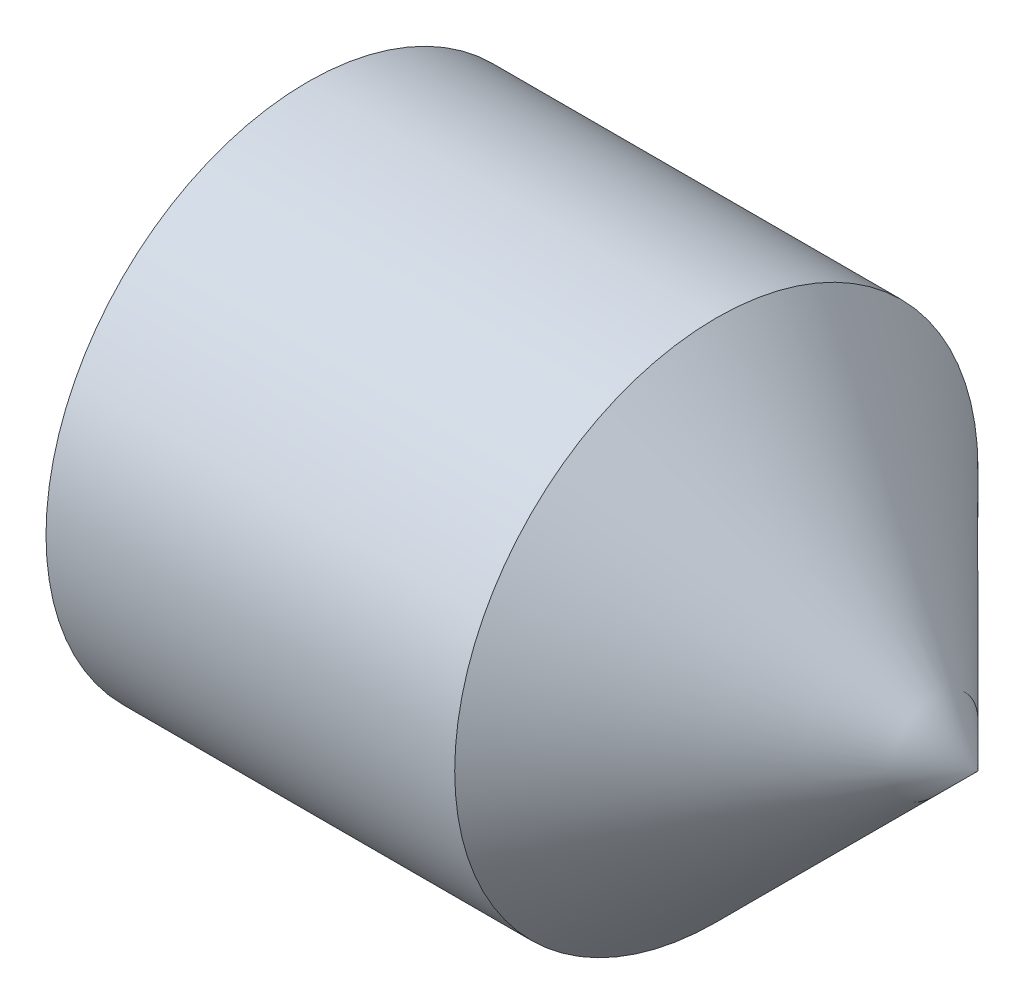
ISO-10303-21;
HEADER;
FILE_DESCRIPTION(('STEP AP214'),'2;1');
FILE_NAME('part.step','',(''),(''),'','','');
FILE_SCHEMA(('AUTOMOTIVE_DESIGN { 1 0 10303 214 1 1 1 1 }'));
ENDSEC;
DATA;
#1=APPLICATION_CONTEXT('core data for automotive mechanical design processes');
#2=APPLICATION_PROTOCOL_DEFINITION('international standard','automotive_design',2000,#1);
#3=PRODUCT_CONTEXT('',#1,'mechanical');
#4=PRODUCT('Part','Part','',(#3));
#5=PRODUCT_RELATED_PRODUCT_CATEGORY('part','',(#4));
#6=PRODUCT_DEFINITION_FORMATION('','',#4);
#7=PRODUCT_DEFINITION_CONTEXT('part definition',#1,'design');
#8=PRODUCT_DEFINITION('design','',#6,#7);
#9=PRODUCT_DEFINITION_SHAPE('','',#8);
#10=(LENGTH_UNIT() NAMED_UNIT(*) SI_UNIT(.MILLI.,.METRE.));
#11=(NAMED_UNIT(*) PLANE_ANGLE_UNIT() SI_UNIT($,.RADIAN.));
#12=(NAMED_UNIT(*) SI_UNIT($,.STERADIAN.) SOLID_ANGLE_UNIT());
#13=UNCERTAINTY_MEASURE_WITH_UNIT(LENGTH_MEASURE(1.E-05),#10,'distance_accuracy_value','');
#14=(GEOMETRIC_REPRESENTATION_CONTEXT(3) GLOBAL_UNCERTAINTY_ASSIGNED_CONTEXT((#13)) GLOBAL_UNIT_ASSIGNED_CONTEXT((#10,
#11,#12)) REPRESENTATION_CONTEXT('',''));
#15=CARTESIAN_POINT('',(0.,0.,0.));
#16=DIRECTION('',(0.,0.,1.));
#17=DIRECTION('',(1.,0.,0.));
#18=AXIS2_PLACEMENT_3D('',#15,#16,#17);
#19=CARTESIAN_POINT('',(2.,-0.749999999999996,0.433012701892218));
#20=DIRECTION('',(0.,-0.5,0.866025403784439));
#21=DIRECTION('',(0.,-0.866025403784439,-0.5));
#22=AXIS2_PLACEMENT_3D('',#19,#20,#21);
#23=PLANE('',#22);
#24=DIRECTION('',(1.,0.,0.));
#25=VECTOR('',#24,1.);
#26=CARTESIAN_POINT('',(2.,0.,0.866025403784437));
#27=LINE('',#26,#25);
#28=CARTESIAN_POINT('',(2.,0.,0.866025403784437));
#29=VERTEX_POINT('',#28);
#30=CARTESIAN_POINT('',(0.,0.,0.866025403784437));
#31=VERTEX_POINT('',#30);
#32=EDGE_CURVE('E85',#29,#31,#27,.F.);
#33=ORIENTED_EDGE('',*,*,#32,.F.);
#34=DIRECTION('',(0.,-0.866025403784439,-0.5));
#35=VECTOR('',#34,1.);
#36=CARTESIAN_POINT('',(2.,-0.749999999999996,0.433012701892218));
#37=LINE('',#36,#35);
#38=CARTESIAN_POINT('',(2.,-0.749999999999996,0.433012701892218));
#39=VERTEX_POINT('',#38);
#40=EDGE_CURVE('E64',#39,#29,#37,.F.);
#41=ORIENTED_EDGE('',*,*,#40,.F.);
#42=DIRECTION('',(1.,0.,0.));
#43=VECTOR('',#42,1.);
#44=CARTESIAN_POINT('',(2.,-0.749999999999996,0.433012701892218));
#45=LINE('',#44,#43);
#46=CARTESIAN_POINT('',(0.,-0.749999999999996,0.433012701892218));
#47=VERTEX_POINT('',#46);
#48=EDGE_CURVE('E88',#47,#39,#45,.T.);
#49=ORIENTED_EDGE('',*,*,#48,.F.);
#50=DIRECTION('',(0.,-0.866025403784439,-0.5));
#51=VECTOR('',#50,1.);
#52=CARTESIAN_POINT('',(0.,-0.749999999999996,0.433012701892218));
#53=LINE('',#52,#51);
#54=EDGE_CURVE('E73',#31,#47,#53,.T.);
#55=ORIENTED_EDGE('',*,*,#54,.F.);
#56=EDGE_LOOP('',(#33,#41,#49,#55));
#57=FACE_BOUND('',#56,.T.);
#58=ADVANCED_FACE('F17',(#57),#23,.F.);
#59=CARTESIAN_POINT('',(2.,0.750000000000003,0.433012701892217));
#60=DIRECTION('',(0.,-0.5,-0.866025403784438));
#61=DIRECTION('',(0.,0.866025403784438,-0.5));
#62=AXIS2_PLACEMENT_3D('',#59,#60,#61);
#63=PLANE('',#62);
#64=DIRECTION('',(0.,0.866025403784438,-0.5));
#65=VECTOR('',#64,1.);
#66=CARTESIAN_POINT('',(2.,0.750000000000003,0.433012701892217));
#67=LINE('',#66,#65);
#68=CARTESIAN_POINT('',(2.,0.750000000000003,0.433012701892217));
#69=VERTEX_POINT('',#68);
#70=EDGE_CURVE('E82',#69,#29,#67,.F.);
#71=ORIENTED_EDGE('',*,*,#70,.T.);
#72=ORIENTED_EDGE('',*,*,#32,.T.);
#73=DIRECTION('',(0.,0.866025403784438,-0.5));
#74=VECTOR('',#73,1.);
#75=CARTESIAN_POINT('',(0.,0.750000000000003,0.433012701892217));
#76=LINE('',#75,#74);
#77=CARTESIAN_POINT('',(0.,0.750000000000003,0.433012701892217));
#78=VERTEX_POINT('',#77);
#79=EDGE_CURVE('E69',#31,#78,#76,.T.);
#80=ORIENTED_EDGE('',*,*,#79,.T.);
#81=DIRECTION('',(1.,0.,0.));
#82=VECTOR('',#81,1.);
#83=CARTESIAN_POINT('',(2.,0.750000000000003,0.433012701892217));
#84=LINE('',#83,#82);
#85=EDGE_CURVE('E98',#78,#69,#84,.T.);
#86=ORIENTED_EDGE('',*,*,#85,.T.);
#87=EDGE_LOOP('',(#71,#72,#80,#86));
#88=FACE_BOUND('',#87,.T.);
#89=ADVANCED_FACE('F91',(#88),#63,.T.);
#90=CARTESIAN_POINT('',(2.,-0.749999999999996,0.433012701892218));
#91=DIRECTION('',(0.,1.,0.));
#92=DIRECTION('',(0.,0.,1.));
#93=AXIS2_PLACEMENT_3D('',#90,#91,#92);
#94=PLANE('',#93);
#95=DIRECTION('',(0.,0.,1.));
#96=VECTOR('',#95,1.);
#97=CARTESIAN_POINT('',(2.,-0.749999999999996,0.866025403784436));
#98=LINE('',#97,#96);
#99=CARTESIAN_POINT('',(2.,-0.749999999999996,-0.433012701892221));
#100=VERTEX_POINT('',#99);
#101=EDGE_CURVE('E104',#100,#39,#98,.T.);
#102=ORIENTED_EDGE('',*,*,#101,.F.);
#103=DIRECTION('',(1.,0.,0.));
#104=VECTOR('',#103,1.);
#105=CARTESIAN_POINT('',(2.,-0.749999999999996,-0.433012701892221));
#106=LINE('',#105,#104);
#107=CARTESIAN_POINT('',(0.,-0.749999999999996,-0.433012701892221));
#108=VERTEX_POINT('',#107);
#109=EDGE_CURVE('E109',#108,#100,#106,.T.);
#110=ORIENTED_EDGE('',*,*,#109,.F.);
#111=DIRECTION('',(0.,0.,1.));
#112=VECTOR('',#111,1.);
#113=CARTESIAN_POINT('',(0.,-0.749999999999996,0.433012701892218));
#114=LINE('',#113,#112);
#115=EDGE_CURVE('E92',#108,#47,#114,.T.);
#116=ORIENTED_EDGE('',*,*,#115,.T.);
#117=ORIENTED_EDGE('',*,*,#48,.T.);
#118=EDGE_LOOP('',(#102,#110,#116,#117));
#119=FACE_BOUND('',#118,.T.);
#120=ADVANCED_FACE('F204',(#119),#94,.T.);
#121=CARTESIAN_POINT('',(2.,0.750000000000003,0.433012701892217));
#122=DIRECTION('',(0.,1.,0.));
#123=DIRECTION('',(0.,0.,1.));
#124=AXIS2_PLACEMENT_3D('',#121,#122,#123);
#125=PLANE('',#124);
#126=DIRECTION('',(1.,0.,0.));
#127=VECTOR('',#126,1.);
#128=CARTESIAN_POINT('',(2.,0.750000000000003,-0.433012701892222));
#129=LINE('',#128,#127);
#130=CARTESIAN_POINT('',(0.,0.750000000000003,-0.433012701892222));
#131=VERTEX_POINT('',#130);
#132=CARTESIAN_POINT('',(2.,0.750000000000003,-0.433012701892222));
#133=VERTEX_POINT('',#132);
#134=EDGE_CURVE('E115',#131,#133,#129,.T.);
#135=ORIENTED_EDGE('',*,*,#134,.T.);
#136=DIRECTION('',(0.,0.,1.));
#137=VECTOR('',#136,1.);
#138=CARTESIAN_POINT('',(2.,0.750000000000003,0.866025403784436));
#139=LINE('',#138,#137);
#140=EDGE_CURVE('E101',#69,#133,#139,.F.);
#141=ORIENTED_EDGE('',*,*,#140,.F.);
#142=ORIENTED_EDGE('',*,*,#85,.F.);
#143=DIRECTION('',(0.,0.,1.));
#144=VECTOR('',#143,1.);
#145=CARTESIAN_POINT('',(0.,0.750000000000003,0.433012701892217));
#146=LINE('',#145,#144);
#147=EDGE_CURVE('E77',#131,#78,#146,.T.);
#148=ORIENTED_EDGE('',*,*,#147,.F.);
#149=EDGE_LOOP('',(#135,#141,#142,#148));
#150=FACE_BOUND('',#149,.T.);
#151=ADVANCED_FACE('F195',(#150),#125,.F.);
#152=CARTESIAN_POINT('',(2.,0.,0.866025403784436));
#153=DIRECTION('',(-1.,0.,0.));
#154=DIRECTION('',(0.,0.,1.));
#155=AXIS2_PLACEMENT_3D('',#152,#153,#154);
#156=PLANE('',#155);
#157=ORIENTED_EDGE('',*,*,#101,.T.);
#158=ORIENTED_EDGE('',*,*,#40,.T.);
#159=ORIENTED_EDGE('',*,*,#70,.F.);
#160=ORIENTED_EDGE('',*,*,#140,.T.);
#161=DIRECTION('',(0.,0.866025403784439,0.5));
#162=VECTOR('',#161,1.);
#163=CARTESIAN_POINT('',(2.,0.750000000000003,-0.433012701892222));
#164=LINE('',#163,#162);
#165=CARTESIAN_POINT('',(2.,0.,-0.866025403784441));
#166=VERTEX_POINT('',#165);
#167=EDGE_CURVE('E117',#133,#166,#164,.F.);
#168=ORIENTED_EDGE('',*,*,#167,.T.);
#169=DIRECTION('',(0.,-0.866025403784438,0.500000000000001));
#170=VECTOR('',#169,1.);
#171=CARTESIAN_POINT('',(2.,-0.749999999999996,-0.433012701892221));
#172=LINE('',#171,#170);
#173=EDGE_CURVE('E112',#100,#166,#172,.F.);
#174=ORIENTED_EDGE('',*,*,#173,.F.);
#175=EDGE_LOOP('',(#157,#158,#159,#160,#168,#174));
#176=FACE_BOUND('',#175,.T.);
#177=ADVANCED_FACE('F185',(#176),#156,.T.);
#178=CARTESIAN_POINT('',(2.,-0.749999999999996,-0.433012701892221));
#179=DIRECTION('',(0.,0.500000000000001,0.866025403784438));
#180=DIRECTION('',(0.,-0.866025403784438,0.500000000000001));
#181=AXIS2_PLACEMENT_3D('',#178,#179,#180);
#182=PLANE('',#181);
#183=ORIENTED_EDGE('',*,*,#173,.T.);
#184=DIRECTION('',(1.,0.,0.));
#185=VECTOR('',#184,1.);
#186=CARTESIAN_POINT('',(2.,0.,-0.866025403784441));
#187=LINE('',#186,#185);
#188=CARTESIAN_POINT('',(0.,0.,-0.866025403784441));
#189=VERTEX_POINT('',#188);
#190=EDGE_CURVE('E119',#166,#189,#187,.F.);
#191=ORIENTED_EDGE('',*,*,#190,.T.);
#192=DIRECTION('',(0.,-0.866025403784438,0.500000000000001));
#193=VECTOR('',#192,1.);
#194=CARTESIAN_POINT('',(0.,-0.749999999999996,-0.433012701892221));
#195=LINE('',#194,#193);
#196=EDGE_CURVE('E106',#189,#108,#195,.T.);
#197=ORIENTED_EDGE('',*,*,#196,.T.);
#198=ORIENTED_EDGE('',*,*,#109,.T.);
#199=EDGE_LOOP('',(#183,#191,#197,#198));
#200=FACE_BOUND('',#199,.T.);
#201=ADVANCED_FACE('F142',(#200),#182,.T.);
#202=CARTESIAN_POINT('',(2.,0.750000000000003,-0.433012701892222));
#203=DIRECTION('',(0.,0.5,-0.866025403784439));
#204=DIRECTION('',(0.,0.866025403784439,0.5));
#205=AXIS2_PLACEMENT_3D('',#202,#203,#204);
#206=PLANE('',#205);
#207=ORIENTED_EDGE('',*,*,#190,.F.);
#208=ORIENTED_EDGE('',*,*,#167,.F.);
#209=ORIENTED_EDGE('',*,*,#134,.F.);
#210=DIRECTION('',(0.,0.866025403784439,0.5));
#211=VECTOR('',#210,1.);
#212=CARTESIAN_POINT('',(0.,0.,-0.866025403784441));
#213=LINE('',#212,#211);
#214=EDGE_CURVE('E122',#189,#131,#213,.T.);
#215=ORIENTED_EDGE('',*,*,#214,.F.);
#216=EDGE_LOOP('',(#207,#208,#209,#215));
#217=FACE_BOUND('',#216,.T.);
#218=ADVANCED_FACE('F133',(#217),#206,.F.);
#219=CARTESIAN_POINT('',(0.,0.,0.));
#220=DIRECTION('',(-1.,0.,0.));
#221=DIRECTION('',(0.,0.,1.));
#222=AXIS2_PLACEMENT_3D('',#219,#220,#221);
#223=PLANE('',#222);
#224=ORIENTED_EDGE('',*,*,#196,.F.);
#225=ORIENTED_EDGE('',*,*,#214,.T.);
#226=ORIENTED_EDGE('',*,*,#147,.T.);
#227=ORIENTED_EDGE('',*,*,#79,.F.);
#228=ORIENTED_EDGE('',*,*,#54,.T.);
#229=ORIENTED_EDGE('',*,*,#115,.F.);
#230=EDGE_LOOP('',(#224,#225,#226,#227,#228,#229));
#231=FACE_BOUND('',#230,.T.);
#232=CARTESIAN_POINT('',(-4.80496447751583E-11,0.,0.));
#233=DIRECTION('',(1.,0.,0.));
#234=DIRECTION('',(0.,0.,-1.));
#235=AXIS2_PLACEMENT_3D('',#232,#233,#234);
#236=CIRCLE('',#235,1.2194999999906);
#237=CARTESIAN_POINT('',(-4.80496447751583E-11,0.,-1.2194999999906));
#238=VERTEX_POINT('',#237);
#239=EDGE_CURVE('E20',#238,#238,#236,.T.);
#240=ORIENTED_EDGE('',*,*,#239,.F.);
#241=EDGE_LOOP('',(#240));
#242=FACE_BOUND('',#241,.T.);
#243=ADVANCED_FACE('F71',(#231,#242),#223,.T.);
#244=CARTESIAN_POINT('',(2.50499999992826,0.,0.));
#245=DIRECTION('',(-1.,0.,0.));
#246=DIRECTION('',(0.,0.,1.));
#247=AXIS2_PLACEMENT_3D('',#244,#245,#246);
#248=CONICAL_SURFACE('',#247,1.50000000013506,0.785398163397448);
#249=CARTESIAN_POINT('',(2.50499999999999,0.,0.));
#250=DIRECTION('',(-1.,0.,0.));
#251=DIRECTION('',(0.,0.,1.));
#252=AXIS2_PLACEMENT_3D('',#249,#250,#251);
#253=CIRCLE('',#252,1.5);
#254=CARTESIAN_POINT('',(2.50499999999999,0.,1.5));
#255=VERTEX_POINT('',#254);
#256=EDGE_CURVE('E26',#255,#255,#253,.T.);
#257=ORIENTED_EDGE('',*,*,#256,.F.);
#258=EDGE_LOOP('',(#257));
#259=FACE_BOUND('',#258,.T.);
#260=CARTESIAN_POINT('',(3.99999999999068,0.,0.));
#261=VERTEX_POINT('',#260);
#262=VERTEX_LOOP('',#261);
#263=FACE_BOUND('',#262,.T.);
#264=ADVANCED_FACE('F132',(#259,#263),#248,.T.);
#265=CARTESIAN_POINT('',(0.161946750381503,0.,0.));
#266=DIRECTION('',(1.,0.,0.));
#267=DIRECTION('',(0.,0.,-1.));
#268=AXIS2_PLACEMENT_3D('',#265,#266,#267);
#269=CONICAL_SURFACE('',#268,1.49999999985084,1.04719755118977);
#270=CARTESIAN_POINT('',(0.161946750507689,0.,0.));
#271=DIRECTION('',(-1.,0.,0.));
#272=DIRECTION('',(0.,0.,1.));
#273=AXIS2_PLACEMENT_3D('',#270,#271,#272);
#274=CIRCLE('',#273,1.5);
#275=CARTESIAN_POINT('',(0.161946750507689,0.,1.5));
#276=VERTEX_POINT('',#275);
#277=EDGE_CURVE('E11',#276,#276,#274,.F.);
#278=ORIENTED_EDGE('',*,*,#277,.F.);
#279=EDGE_LOOP('',(#278));
#280=FACE_BOUND('',#279,.T.);
#281=ORIENTED_EDGE('',*,*,#239,.T.);
#282=EDGE_LOOP('',(#281));
#283=FACE_BOUND('',#282,.T.);
#284=ADVANCED_FACE('F130',(#280,#283),#269,.T.);
#285=CARTESIAN_POINT('',(-12.7,0.,0.));
#286=DIRECTION('',(-1.,0.,0.));
#287=DIRECTION('',(0.,0.,1.));
#288=AXIS2_PLACEMENT_3D('',#285,#286,#287);
#289=CYLINDRICAL_SURFACE('',#288,1.5);
#290=ORIENTED_EDGE('',*,*,#277,.T.);
#291=EDGE_LOOP('',(#290));
#292=FACE_BOUND('',#291,.T.);
#293=ORIENTED_EDGE('',*,*,#256,.T.);
#294=EDGE_LOOP('',(#293));
#295=FACE_BOUND('',#294,.T.);
#296=ADVANCED_FACE('F145',(#292,#295),#289,.T.);
#297=CLOSED_SHELL('',(#58,#89,#120,#151,#177,#201,#218,#243,#264,#284,#296));
#298=MANIFOLD_SOLID_BREP('B1',#297);
#299=ADVANCED_BREP_SHAPE_REPRESENTATION('',(#18,#298),#14);
#300=SHAPE_DEFINITION_REPRESENTATION(#9,#299);
ENDSEC;
END-ISO-10303-21;
